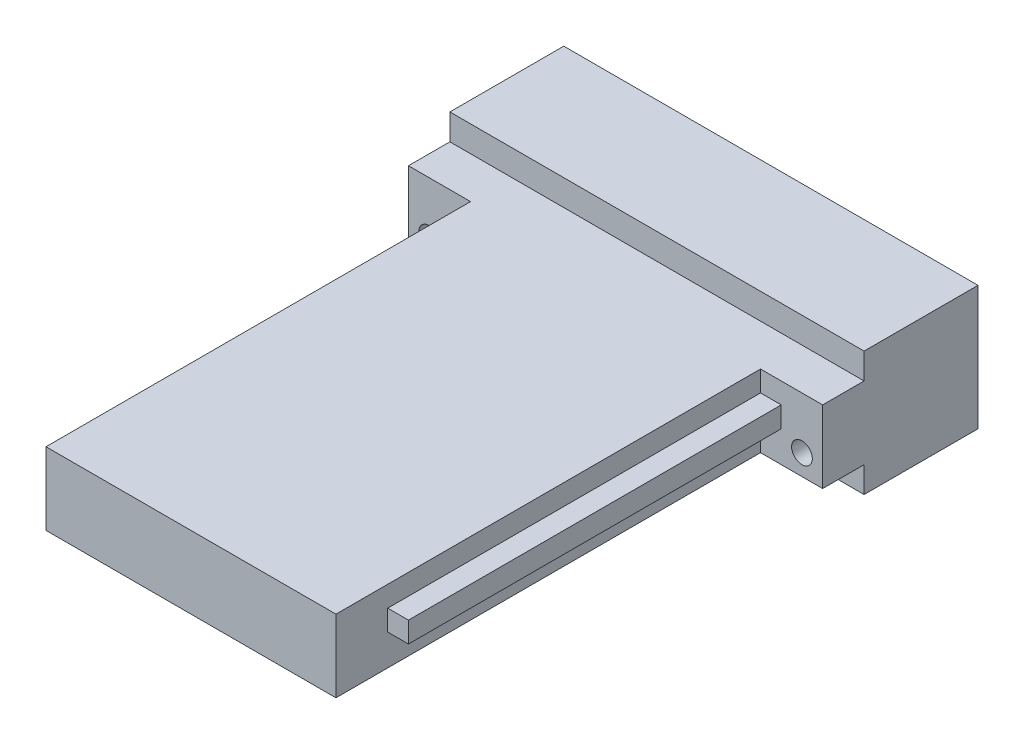
ISO-10303-21;
HEADER;
FILE_DESCRIPTION(('STEP AP214'),'2;1');
FILE_NAME('part.step','',(''),(''),'','','');
FILE_SCHEMA(('AUTOMOTIVE_DESIGN { 1 0 10303 214 1 1 1 1 }'));
ENDSEC;
DATA;
#1=APPLICATION_CONTEXT('core data for automotive mechanical design processes');
#2=APPLICATION_PROTOCOL_DEFINITION('international standard','automotive_design',2000,#1);
#3=PRODUCT_CONTEXT('',#1,'mechanical');
#4=PRODUCT('Part','Part','',(#3));
#5=PRODUCT_RELATED_PRODUCT_CATEGORY('part','',(#4));
#6=PRODUCT_DEFINITION_FORMATION('','',#4);
#7=PRODUCT_DEFINITION_CONTEXT('part definition',#1,'design');
#8=PRODUCT_DEFINITION('design','',#6,#7);
#9=PRODUCT_DEFINITION_SHAPE('','',#8);
#10=(LENGTH_UNIT() NAMED_UNIT(*) SI_UNIT(.MILLI.,.METRE.));
#11=(NAMED_UNIT(*) PLANE_ANGLE_UNIT() SI_UNIT($,.RADIAN.));
#12=(NAMED_UNIT(*) SI_UNIT($,.STERADIAN.) SOLID_ANGLE_UNIT());
#13=UNCERTAINTY_MEASURE_WITH_UNIT(LENGTH_MEASURE(1.E-05),#10,'distance_accuracy_value','');
#14=(GEOMETRIC_REPRESENTATION_CONTEXT(3) GLOBAL_UNCERTAINTY_ASSIGNED_CONTEXT((#13)) GLOBAL_UNIT_ASSIGNED_CONTEXT((#10,
#11,#12)) REPRESENTATION_CONTEXT('',''));
#15=CARTESIAN_POINT('',(0.,0.,0.));
#16=DIRECTION('',(0.,0.,1.));
#17=DIRECTION('',(1.,0.,0.));
#18=AXIS2_PLACEMENT_3D('',#15,#16,#17);
#19=CARTESIAN_POINT('',(0.,0.,-46.));
#20=DIRECTION('',(0.,0.,-1.));
#21=DIRECTION('',(-1.,0.,0.));
#22=AXIS2_PLACEMENT_3D('',#19,#20,#21);
#23=PLANE('',#22);
#24=DIRECTION('',(-1.,0.,0.));
#25=VECTOR('',#24,1.);
#26=CARTESIAN_POINT('',(26.,1.,-46.));
#27=LINE('',#26,#25);
#28=CARTESIAN_POINT('',(26.,1.,-46.));
#29=VERTEX_POINT('',#28);
#30=CARTESIAN_POINT('',(2.,1.,-46.));
#31=VERTEX_POINT('',#30);
#32=EDGE_CURVE('E256',#29,#31,#27,.T.);
#33=ORIENTED_EDGE('',*,*,#32,.F.);
#34=DIRECTION('',(0.,-1.,0.));
#35=VECTOR('',#34,1.);
#36=CARTESIAN_POINT('',(26.,8.5,-46.));
#37=LINE('',#36,#35);
#38=CARTESIAN_POINT('',(26.,-1.5,-46.));
#39=VERTEX_POINT('',#38);
#40=EDGE_CURVE('E268',#29,#39,#37,.T.);
#41=ORIENTED_EDGE('',*,*,#40,.T.);
#42=DIRECTION('',(-1.,0.,0.));
#43=VECTOR('',#42,1.);
#44=CARTESIAN_POINT('',(26.,-1.5,-46.));
#45=LINE('',#44,#43);
#46=CARTESIAN_POINT('',(2.,-1.5,-46.));
#47=VERTEX_POINT('',#46);
#48=EDGE_CURVE('E285',#39,#47,#45,.T.);
#49=ORIENTED_EDGE('',*,*,#48,.T.);
#50=DIRECTION('',(0.,1.,0.));
#51=VECTOR('',#50,1.);
#52=CARTESIAN_POINT('',(2.,8.5,-46.));
#53=LINE('',#52,#51);
#54=EDGE_CURVE('E270',#47,#31,#53,.T.);
#55=ORIENTED_EDGE('',*,*,#54,.T.);
#56=EDGE_LOOP('',(#33,#41,#49,#55));
#57=FACE_BOUND('',#56,.T.);
#58=ADVANCED_FACE('F46',(#57),#23,.T.);
#59=CARTESIAN_POINT('',(28.,7.,0.));
#60=DIRECTION('',(-1.,0.,0.));
#61=DIRECTION('',(0.,0.,1.));
#62=AXIS2_PLACEMENT_3D('',#59,#60,#61);
#63=PLANE('',#62);
#64=DIRECTION('',(0.,0.,1.));
#65=VECTOR('',#64,1.);
#66=CARTESIAN_POINT('',(28.,5.,-41.));
#67=LINE('',#66,#65);
#68=CARTESIAN_POINT('',(28.,5.,-41.));
#69=VERTEX_POINT('',#68);
#70=CARTESIAN_POINT('',(28.,5.,-5.));
#71=VERTEX_POINT('',#70);
#72=EDGE_CURVE('E362',#69,#71,#67,.T.);
#73=ORIENTED_EDGE('',*,*,#72,.F.);
#74=DIRECTION('',(0.,-1.,0.));
#75=VECTOR('',#74,1.);
#76=CARTESIAN_POINT('',(28.,0.,-41.));
#77=LINE('',#76,#75);
#78=CARTESIAN_POINT('',(28.,7.,-41.));
#79=VERTEX_POINT('',#78);
#80=EDGE_CURVE('E462',#79,#69,#77,.T.);
#81=ORIENTED_EDGE('',*,*,#80,.F.);
#82=DIRECTION('',(0.,0.,-1.));
#83=VECTOR('',#82,1.);
#84=CARTESIAN_POINT('',(28.,7.,0.));
#85=LINE('',#84,#83);
#86=CARTESIAN_POINT('',(28.,7.,0.));
#87=VERTEX_POINT('',#86);
#88=EDGE_CURVE('E484',#87,#79,#85,.T.);
#89=ORIENTED_EDGE('',*,*,#88,.F.);
#90=DIRECTION('',(0.,-1.,0.));
#91=VECTOR('',#90,1.);
#92=CARTESIAN_POINT('',(28.,7.,0.));
#93=LINE('',#92,#91);
#94=CARTESIAN_POINT('',(28.,0.,0.));
#95=VERTEX_POINT('',#94);
#96=EDGE_CURVE('E11',#87,#95,#93,.T.);
#97=ORIENTED_EDGE('',*,*,#96,.T.);
#98=DIRECTION('',(0.,0.,-1.));
#99=VECTOR('',#98,1.);
#100=CARTESIAN_POINT('',(28.,0.,0.));
#101=LINE('',#100,#99);
#102=CARTESIAN_POINT('',(28.,0.,-41.));
#103=VERTEX_POINT('',#102);
#104=EDGE_CURVE('E498',#95,#103,#101,.T.);
#105=ORIENTED_EDGE('',*,*,#104,.T.);
#106=CARTESIAN_POINT('',(28.,3.,-41.));
#107=VERTEX_POINT('',#106);
#108=EDGE_CURVE('E456',#107,#103,#77,.T.);
#109=ORIENTED_EDGE('',*,*,#108,.F.);
#110=DIRECTION('',(0.,0.,1.));
#111=VECTOR('',#110,1.);
#112=CARTESIAN_POINT('',(28.,3.,-41.));
#113=LINE('',#112,#111);
#114=CARTESIAN_POINT('',(28.,3.,-5.));
#115=VERTEX_POINT('',#114);
#116=EDGE_CURVE('E357',#107,#115,#113,.T.);
#117=ORIENTED_EDGE('',*,*,#116,.T.);
#118=DIRECTION('',(0.,-1.,0.));
#119=VECTOR('',#118,1.);
#120=CARTESIAN_POINT('',(28.,5.,-5.));
#121=LINE('',#120,#119);
#122=EDGE_CURVE('E374',#71,#115,#121,.T.);
#123=ORIENTED_EDGE('',*,*,#122,.F.);
#124=EDGE_LOOP('',(#73,#81,#89,#97,#105,#109,#117,#123));
#125=FACE_BOUND('',#124,.T.);
#126=ADVANCED_FACE('F577',(#125),#63,.F.);
#127=CARTESIAN_POINT('',(34.,0.,-41.));
#128=DIRECTION('',(0.,0.,-1.));
#129=DIRECTION('',(-1.,0.,0.));
#130=AXIS2_PLACEMENT_3D('',#127,#128,#129);
#131=PLANE('',#130);
#132=CARTESIAN_POINT('',(32.,2.,-41.));
#133=DIRECTION('',(0.,0.,1.));
#134=DIRECTION('',(1.,0.,0.));
#135=AXIS2_PLACEMENT_3D('',#132,#133,#134);
#136=CIRCLE('',#135,0.999999999999998);
#137=CARTESIAN_POINT('',(33.,2.,-41.));
#138=VERTEX_POINT('',#137);
#139=EDGE_CURVE('E434',#138,#138,#136,.T.);
#140=ORIENTED_EDGE('',*,*,#139,.F.);
#141=EDGE_LOOP('',(#140));
#142=FACE_BOUND('',#141,.T.);
#143=DIRECTION('',(-1.,0.,0.));
#144=VECTOR('',#143,1.);
#145=CARTESIAN_POINT('',(30.,5.,-41.));
#146=LINE('',#145,#144);
#147=CARTESIAN_POINT('',(30.,5.,-41.));
#148=VERTEX_POINT('',#147);
#149=EDGE_CURVE('E380',#148,#69,#146,.T.);
#150=ORIENTED_EDGE('',*,*,#149,.F.);
#151=DIRECTION('',(0.,-1.,0.));
#152=VECTOR('',#151,1.);
#153=CARTESIAN_POINT('',(30.,5.,-41.));
#154=LINE('',#153,#152);
#155=CARTESIAN_POINT('',(30.,3.,-41.));
#156=VERTEX_POINT('',#155);
#157=EDGE_CURVE('E358',#148,#156,#154,.T.);
#158=ORIENTED_EDGE('',*,*,#157,.T.);
#159=DIRECTION('',(-1.,0.,0.));
#160=VECTOR('',#159,1.);
#161=CARTESIAN_POINT('',(30.,3.,-41.));
#162=LINE('',#161,#160);
#163=EDGE_CURVE('E371',#156,#107,#162,.T.);
#164=ORIENTED_EDGE('',*,*,#163,.T.);
#165=ORIENTED_EDGE('',*,*,#108,.T.);
#166=DIRECTION('',(-1.,0.,0.));
#167=VECTOR('',#166,1.);
#168=CARTESIAN_POINT('',(34.,0.,-41.));
#169=LINE('',#168,#167);
#170=CARTESIAN_POINT('',(34.,0.,-41.));
#171=VERTEX_POINT('',#170);
#172=EDGE_CURVE('E469',#171,#103,#169,.T.);
#173=ORIENTED_EDGE('',*,*,#172,.F.);
#174=DIRECTION('',(0.,-1.,0.));
#175=VECTOR('',#174,1.);
#176=CARTESIAN_POINT('',(34.,0.,-41.));
#177=LINE('',#176,#175);
#178=CARTESIAN_POINT('',(34.,7.,-41.));
#179=VERTEX_POINT('',#178);
#180=EDGE_CURVE('E461',#179,#171,#177,.T.);
#181=ORIENTED_EDGE('',*,*,#180,.F.);
#182=DIRECTION('',(-1.,0.,0.));
#183=VECTOR('',#182,1.);
#184=CARTESIAN_POINT('',(34.,7.,-41.));
#185=LINE('',#184,#183);
#186=EDGE_CURVE('E476',#179,#79,#185,.T.);
#187=ORIENTED_EDGE('',*,*,#186,.T.);
#188=ORIENTED_EDGE('',*,*,#80,.T.);
#189=EDGE_LOOP('',(#150,#158,#164,#165,#173,#181,#187,#188));
#190=FACE_BOUND('',#189,.T.);
#191=ADVANCED_FACE('F581',(#142,#190),#131,.F.);
#192=CARTESIAN_POINT('',(0.,7.,0.));
#193=DIRECTION('',(-1.,0.,0.));
#194=DIRECTION('',(0.,0.,1.));
#195=AXIS2_PLACEMENT_3D('',#192,#193,#194);
#196=PLANE('',#195);
#197=DIRECTION('',(0.,-1.,0.));
#198=VECTOR('',#197,1.);
#199=CARTESIAN_POINT('',(0.,5.,-5.));
#200=LINE('',#199,#198);
#201=CARTESIAN_POINT('',(0.,5.,-5.));
#202=VERTEX_POINT('',#201);
#203=CARTESIAN_POINT('',(0.,3.,-5.));
#204=VERTEX_POINT('',#203);
#205=EDGE_CURVE('E408',#202,#204,#200,.T.);
#206=ORIENTED_EDGE('',*,*,#205,.T.);
#207=DIRECTION('',(0.,0.,1.));
#208=VECTOR('',#207,1.);
#209=CARTESIAN_POINT('',(0.,3.,-41.));
#210=LINE('',#209,#208);
#211=CARTESIAN_POINT('',(0.,3.,-41.));
#212=VERTEX_POINT('',#211);
#213=EDGE_CURVE('E384',#212,#204,#210,.T.);
#214=ORIENTED_EDGE('',*,*,#213,.F.);
#215=DIRECTION('',(0.,-1.,0.));
#216=VECTOR('',#215,1.);
#217=CARTESIAN_POINT('',(0.,7.,-41.));
#218=LINE('',#217,#216);
#219=CARTESIAN_POINT('',(0.,0.,-41.));
#220=VERTEX_POINT('',#219);
#221=EDGE_CURVE('E438',#212,#220,#218,.T.);
#222=ORIENTED_EDGE('',*,*,#221,.T.);
#223=DIRECTION('',(0.,0.,-1.));
#224=VECTOR('',#223,1.);
#225=CARTESIAN_POINT('',(0.,0.,0.));
#226=LINE('',#225,#224);
#227=CARTESIAN_POINT('',(0.,0.,0.));
#228=VERTEX_POINT('',#227);
#229=EDGE_CURVE('E485',#228,#220,#226,.T.);
#230=ORIENTED_EDGE('',*,*,#229,.F.);
#231=DIRECTION('',(0.,-1.,0.));
#232=VECTOR('',#231,1.);
#233=CARTESIAN_POINT('',(0.,7.,0.));
#234=LINE('',#233,#232);
#235=CARTESIAN_POINT('',(0.,7.,0.));
#236=VERTEX_POINT('',#235);
#237=EDGE_CURVE('E54',#236,#228,#234,.T.);
#238=ORIENTED_EDGE('',*,*,#237,.F.);
#239=DIRECTION('',(0.,0.,-1.));
#240=VECTOR('',#239,1.);
#241=CARTESIAN_POINT('',(0.,7.,0.));
#242=LINE('',#241,#240);
#243=CARTESIAN_POINT('',(0.,7.,-41.));
#244=VERTEX_POINT('',#243);
#245=EDGE_CURVE('E493',#236,#244,#242,.T.);
#246=ORIENTED_EDGE('',*,*,#245,.T.);
#247=CARTESIAN_POINT('',(0.,5.,-41.));
#248=VERTEX_POINT('',#247);
#249=EDGE_CURVE('E445',#244,#248,#218,.T.);
#250=ORIENTED_EDGE('',*,*,#249,.T.);
#251=DIRECTION('',(0.,0.,1.));
#252=VECTOR('',#251,1.);
#253=CARTESIAN_POINT('',(0.,5.,-41.));
#254=LINE('',#253,#252);
#255=EDGE_CURVE('E397',#248,#202,#254,.T.);
#256=ORIENTED_EDGE('',*,*,#255,.T.);
#257=EDGE_LOOP('',(#206,#214,#222,#230,#238,#246,#250,#256));
#258=FACE_BOUND('',#257,.T.);
#259=ADVANCED_FACE('F516',(#258),#196,.T.);
#260=CARTESIAN_POINT('',(-6.,7.,-41.));
#261=DIRECTION('',(0.,0.,1.));
#262=DIRECTION('',(1.,0.,0.));
#263=AXIS2_PLACEMENT_3D('',#260,#261,#262);
#264=PLANE('',#263);
#265=CARTESIAN_POINT('',(-4.,2.,-41.));
#266=DIRECTION('',(0.,0.,1.));
#267=DIRECTION('',(1.,0.,0.));
#268=AXIS2_PLACEMENT_3D('',#265,#266,#267);
#269=CIRCLE('',#268,1.);
#270=CARTESIAN_POINT('',(-3.,2.,-41.));
#271=VERTEX_POINT('',#270);
#272=EDGE_CURVE('E263',#271,#271,#269,.T.);
#273=ORIENTED_EDGE('',*,*,#272,.F.);
#274=EDGE_LOOP('',(#273));
#275=FACE_BOUND('',#274,.T.);
#276=ORIENTED_EDGE('',*,*,#221,.F.);
#277=DIRECTION('',(1.,0.,0.));
#278=VECTOR('',#277,1.);
#279=CARTESIAN_POINT('',(-2.,3.,-41.));
#280=LINE('',#279,#278);
#281=CARTESIAN_POINT('',(-2.,3.,-41.));
#282=VERTEX_POINT('',#281);
#283=EDGE_CURVE('E418',#282,#212,#280,.T.);
#284=ORIENTED_EDGE('',*,*,#283,.F.);
#285=DIRECTION('',(0.,-1.,0.));
#286=VECTOR('',#285,1.);
#287=CARTESIAN_POINT('',(-2.,5.,-41.));
#288=LINE('',#287,#286);
#289=CARTESIAN_POINT('',(-2.,5.,-41.));
#290=VERTEX_POINT('',#289);
#291=EDGE_CURVE('E393',#290,#282,#288,.T.);
#292=ORIENTED_EDGE('',*,*,#291,.F.);
#293=DIRECTION('',(1.,0.,0.));
#294=VECTOR('',#293,1.);
#295=CARTESIAN_POINT('',(-2.,5.,-41.));
#296=LINE('',#295,#294);
#297=EDGE_CURVE('E405',#290,#248,#296,.T.);
#298=ORIENTED_EDGE('',*,*,#297,.T.);
#299=ORIENTED_EDGE('',*,*,#249,.F.);
#300=DIRECTION('',(1.,0.,0.));
#301=VECTOR('',#300,1.);
#302=CARTESIAN_POINT('',(-6.,7.,-41.));
#303=LINE('',#302,#301);
#304=CARTESIAN_POINT('',(-6.,7.,-41.));
#305=VERTEX_POINT('',#304);
#306=EDGE_CURVE('E450',#305,#244,#303,.T.);
#307=ORIENTED_EDGE('',*,*,#306,.F.);
#308=DIRECTION('',(0.,-1.,0.));
#309=VECTOR('',#308,1.);
#310=CARTESIAN_POINT('',(-6.,7.,-41.));
#311=LINE('',#310,#309);
#312=CARTESIAN_POINT('',(-6.,0.,-41.));
#313=VERTEX_POINT('',#312);
#314=EDGE_CURVE('E444',#305,#313,#311,.T.);
#315=ORIENTED_EDGE('',*,*,#314,.T.);
#316=DIRECTION('',(1.,0.,0.));
#317=VECTOR('',#316,1.);
#318=CARTESIAN_POINT('',(-6.,0.,-41.));
#319=LINE('',#318,#317);
#320=EDGE_CURVE('E453',#313,#220,#319,.T.);
#321=ORIENTED_EDGE('',*,*,#320,.T.);
#322=EDGE_LOOP('',(#276,#284,#292,#298,#299,#307,#315,#321));
#323=FACE_BOUND('',#322,.T.);
#324=ADVANCED_FACE('F519',(#275,#323),#264,.T.);
#325=CARTESIAN_POINT('',(0.,7.,0.));
#326=DIRECTION('',(0.,0.,-1.));
#327=DIRECTION('',(-1.,0.,0.));
#328=AXIS2_PLACEMENT_3D('',#325,#326,#327);
#329=PLANE('',#328);
#330=DIRECTION('',(1.,0.,0.));
#331=VECTOR('',#330,1.);
#332=CARTESIAN_POINT('',(0.,0.,0.));
#333=LINE('',#332,#331);
#334=EDGE_CURVE('E480',#228,#95,#333,.T.);
#335=ORIENTED_EDGE('',*,*,#334,.T.);
#336=ORIENTED_EDGE('',*,*,#96,.F.);
#337=DIRECTION('',(1.,0.,0.));
#338=VECTOR('',#337,1.);
#339=CARTESIAN_POINT('',(0.,7.,0.));
#340=LINE('',#339,#338);
#341=EDGE_CURVE('E481',#236,#87,#340,.T.);
#342=ORIENTED_EDGE('',*,*,#341,.F.);
#343=ORIENTED_EDGE('',*,*,#237,.T.);
#344=EDGE_LOOP('',(#335,#336,#342,#343));
#345=FACE_BOUND('',#344,.T.);
#346=ADVANCED_FACE('F48',(#345),#329,.F.);
#347=CARTESIAN_POINT('',(0.,7.,0.));
#348=DIRECTION('',(0.,1.,0.));
#349=DIRECTION('',(0.,0.,1.));
#350=AXIS2_PLACEMENT_3D('',#347,#348,#349);
#351=PLANE('',#350);
#352=ORIENTED_EDGE('',*,*,#341,.T.);
#353=ORIENTED_EDGE('',*,*,#88,.T.);
#354=ORIENTED_EDGE('',*,*,#186,.F.);
#355=DIRECTION('',(0.,0.,1.));
#356=VECTOR('',#355,1.);
#357=CARTESIAN_POINT('',(34.,7.,-45.));
#358=LINE('',#357,#356);
#359=CARTESIAN_POINT('',(34.,7.,-45.));
#360=VERTEX_POINT('',#359);
#361=EDGE_CURVE('E458',#360,#179,#358,.T.);
#362=ORIENTED_EDGE('',*,*,#361,.F.);
#363=DIRECTION('',(1.,0.,0.));
#364=VECTOR('',#363,1.);
#365=CARTESIAN_POINT('',(0.,7.,-45.));
#366=LINE('',#365,#364);
#367=CARTESIAN_POINT('',(-6.,7.,-45.));
#368=VERTEX_POINT('',#367);
#369=EDGE_CURVE('E489',#368,#360,#366,.T.);
#370=ORIENTED_EDGE('',*,*,#369,.F.);
#371=DIRECTION('',(0.,0.,1.));
#372=VECTOR('',#371,1.);
#373=CARTESIAN_POINT('',(-6.,7.,-45.));
#374=LINE('',#373,#372);
#375=EDGE_CURVE('E441',#368,#305,#374,.T.);
#376=ORIENTED_EDGE('',*,*,#375,.T.);
#377=ORIENTED_EDGE('',*,*,#306,.T.);
#378=ORIENTED_EDGE('',*,*,#245,.F.);
#379=EDGE_LOOP('',(#352,#353,#354,#362,#370,#376,#377,#378));
#380=FACE_BOUND('',#379,.T.);
#381=ADVANCED_FACE('F593',(#380),#351,.T.);
#382=CARTESIAN_POINT('',(0.,0.,0.));
#383=DIRECTION('',(0.,1.,0.));
#384=DIRECTION('',(0.,0.,1.));
#385=AXIS2_PLACEMENT_3D('',#382,#383,#384);
#386=PLANE('',#385);
#387=ORIENTED_EDGE('',*,*,#334,.F.);
#388=ORIENTED_EDGE('',*,*,#229,.T.);
#389=ORIENTED_EDGE('',*,*,#320,.F.);
#390=DIRECTION('',(0.,0.,1.));
#391=VECTOR('',#390,1.);
#392=CARTESIAN_POINT('',(-6.,0.,-45.));
#393=LINE('',#392,#391);
#394=CARTESIAN_POINT('',(-6.,0.,-45.));
#395=VERTEX_POINT('',#394);
#396=EDGE_CURVE('E448',#395,#313,#393,.T.);
#397=ORIENTED_EDGE('',*,*,#396,.F.);
#398=DIRECTION('',(1.,0.,0.));
#399=VECTOR('',#398,1.);
#400=CARTESIAN_POINT('',(0.,0.,-45.));
#401=LINE('',#400,#399);
#402=CARTESIAN_POINT('',(34.,0.,-45.));
#403=VERTEX_POINT('',#402);
#404=EDGE_CURVE('E502',#395,#403,#401,.T.);
#405=ORIENTED_EDGE('',*,*,#404,.T.);
#406=DIRECTION('',(0.,0.,-1.));
#407=VECTOR('',#406,1.);
#408=CARTESIAN_POINT('',(34.,0.,-45.));
#409=LINE('',#408,#407);
#410=EDGE_CURVE('E465',#171,#403,#409,.T.);
#411=ORIENTED_EDGE('',*,*,#410,.F.);
#412=ORIENTED_EDGE('',*,*,#172,.T.);
#413=ORIENTED_EDGE('',*,*,#104,.F.);
#414=EDGE_LOOP('',(#387,#388,#389,#397,#405,#411,#412,#413));
#415=FACE_BOUND('',#414,.T.);
#416=ADVANCED_FACE('F514',(#415),#386,.F.);
#417=CARTESIAN_POINT('',(34.,0.,0.));
#418=DIRECTION('',(1.,0.,0.));
#419=DIRECTION('',(0.,0.,-1.));
#420=AXIS2_PLACEMENT_3D('',#417,#418,#419);
#421=PLANE('',#420);
#422=ORIENTED_EDGE('',*,*,#410,.T.);
#423=DIRECTION('',(0.,-1.,0.));
#424=VECTOR('',#423,1.);
#425=CARTESIAN_POINT('',(34.,9.5,-45.));
#426=LINE('',#425,#424);
#427=CARTESIAN_POINT('',(34.,-2.5,-45.));
#428=VERTEX_POINT('',#427);
#429=EDGE_CURVE('E310',#403,#428,#426,.T.);
#430=ORIENTED_EDGE('',*,*,#429,.T.);
#431=DIRECTION('',(0.,0.,1.));
#432=VECTOR('',#431,1.);
#433=CARTESIAN_POINT('',(34.,-2.5,-56.));
#434=LINE('',#433,#432);
#435=CARTESIAN_POINT('',(34.,-2.5,-56.));
#436=VERTEX_POINT('',#435);
#437=EDGE_CURVE('E353',#436,#428,#434,.T.);
#438=ORIENTED_EDGE('',*,*,#437,.F.);
#439=DIRECTION('',(0.,-1.,0.));
#440=VECTOR('',#439,1.);
#441=CARTESIAN_POINT('',(34.,9.5,-56.));
#442=LINE('',#441,#440);
#443=CARTESIAN_POINT('',(34.,9.5,-56.));
#444=VERTEX_POINT('',#443);
#445=EDGE_CURVE('E317',#444,#436,#442,.T.);
#446=ORIENTED_EDGE('',*,*,#445,.F.);
#447=DIRECTION('',(0.,0.,1.));
#448=VECTOR('',#447,1.);
#449=CARTESIAN_POINT('',(34.,9.5,-56.));
#450=LINE('',#449,#448);
#451=CARTESIAN_POINT('',(34.,9.5,-45.));
#452=VERTEX_POINT('',#451);
#453=EDGE_CURVE('E330',#444,#452,#450,.T.);
#454=ORIENTED_EDGE('',*,*,#453,.T.);
#455=EDGE_CURVE('E331',#452,#360,#426,.T.);
#456=ORIENTED_EDGE('',*,*,#455,.T.);
#457=ORIENTED_EDGE('',*,*,#361,.T.);
#458=ORIENTED_EDGE('',*,*,#180,.T.);
#459=EDGE_LOOP('',(#422,#430,#438,#446,#454,#456,#457,#458));
#460=FACE_BOUND('',#459,.T.);
#461=ADVANCED_FACE('F539',(#460),#421,.T.);
#462=CARTESIAN_POINT('',(-6.,0.,0.));
#463=DIRECTION('',(1.,0.,0.));
#464=DIRECTION('',(0.,0.,-1.));
#465=AXIS2_PLACEMENT_3D('',#462,#463,#464);
#466=PLANE('',#465);
#467=ORIENTED_EDGE('',*,*,#375,.F.);
#468=DIRECTION('',(0.,1.,0.));
#469=VECTOR('',#468,1.);
#470=CARTESIAN_POINT('',(-6.,9.5,-45.));
#471=LINE('',#470,#469);
#472=CARTESIAN_POINT('',(-6.,9.5,-45.));
#473=VERTEX_POINT('',#472);
#474=EDGE_CURVE('E338',#368,#473,#471,.T.);
#475=ORIENTED_EDGE('',*,*,#474,.T.);
#476=DIRECTION('',(0.,0.,1.));
#477=VECTOR('',#476,1.);
#478=CARTESIAN_POINT('',(-6.,9.5,-56.));
#479=LINE('',#478,#477);
#480=CARTESIAN_POINT('',(-6.,9.5,-56.));
#481=VERTEX_POINT('',#480);
#482=EDGE_CURVE('E347',#481,#473,#479,.T.);
#483=ORIENTED_EDGE('',*,*,#482,.F.);
#484=DIRECTION('',(0.,1.,0.));
#485=VECTOR('',#484,1.);
#486=CARTESIAN_POINT('',(-6.,9.5,-56.));
#487=LINE('',#486,#485);
#488=CARTESIAN_POINT('',(-6.,-2.5,-56.));
#489=VERTEX_POINT('',#488);
#490=EDGE_CURVE('E325',#489,#481,#487,.T.);
#491=ORIENTED_EDGE('',*,*,#490,.F.);
#492=DIRECTION('',(0.,0.,1.));
#493=VECTOR('',#492,1.);
#494=CARTESIAN_POINT('',(-6.,-2.5,-56.));
#495=LINE('',#494,#493);
#496=CARTESIAN_POINT('',(-6.,-2.5,-45.));
#497=VERTEX_POINT('',#496);
#498=EDGE_CURVE('E350',#489,#497,#495,.T.);
#499=ORIENTED_EDGE('',*,*,#498,.T.);
#500=EDGE_CURVE('E339',#497,#395,#471,.T.);
#501=ORIENTED_EDGE('',*,*,#500,.T.);
#502=ORIENTED_EDGE('',*,*,#396,.T.);
#503=ORIENTED_EDGE('',*,*,#314,.F.);
#504=EDGE_LOOP('',(#467,#475,#483,#491,#499,#501,#502,#503));
#505=FACE_BOUND('',#504,.T.);
#506=ADVANCED_FACE('F530',(#505),#466,.F.);
#507=CARTESIAN_POINT('',(-4.,2.,-47.));
#508=DIRECTION('',(0.,0.,1.));
#509=DIRECTION('',(1.,0.,0.));
#510=AXIS2_PLACEMENT_3D('',#507,#508,#509);
#511=CYLINDRICAL_SURFACE('',#510,1.);
#512=ORIENTED_EDGE('',*,*,#272,.T.);
#513=EDGE_LOOP('',(#512));
#514=FACE_BOUND('',#513,.T.);
#515=CARTESIAN_POINT('',(-4.,2.,-56.));
#516=DIRECTION('',(0.,0.,1.));
#517=DIRECTION('',(1.,0.,0.));
#518=AXIS2_PLACEMENT_3D('',#515,#516,#517);
#519=CIRCLE('',#518,1.);
#520=CARTESIAN_POINT('',(-3.,2.,-56.));
#521=VERTEX_POINT('',#520);
#522=EDGE_CURVE('E668',#521,#521,#519,.T.);
#523=ORIENTED_EDGE('',*,*,#522,.F.);
#524=EDGE_LOOP('',(#523));
#525=FACE_BOUND('',#524,.T.);
#526=ADVANCED_FACE('F604',(#514,#525),#511,.F.);
#527=CARTESIAN_POINT('',(32.,2.,-47.));
#528=DIRECTION('',(0.,0.,1.));
#529=DIRECTION('',(1.,0.,0.));
#530=AXIS2_PLACEMENT_3D('',#527,#528,#529);
#531=CYLINDRICAL_SURFACE('',#530,0.999999999999998);
#532=ORIENTED_EDGE('',*,*,#139,.T.);
#533=EDGE_LOOP('',(#532));
#534=FACE_BOUND('',#533,.T.);
#535=CARTESIAN_POINT('',(32.,2.,-56.));
#536=DIRECTION('',(0.,0.,1.));
#537=DIRECTION('',(1.,0.,0.));
#538=AXIS2_PLACEMENT_3D('',#535,#536,#537);
#539=CIRCLE('',#538,0.999999999999998);
#540=CARTESIAN_POINT('',(33.,2.,-56.));
#541=VERTEX_POINT('',#540);
#542=EDGE_CURVE('E273',#541,#541,#539,.T.);
#543=ORIENTED_EDGE('',*,*,#542,.F.);
#544=EDGE_LOOP('',(#543));
#545=FACE_BOUND('',#544,.T.);
#546=ADVANCED_FACE('F607',(#534,#545),#531,.F.);
#547=CARTESIAN_POINT('',(-2.,3.,-41.));
#548=DIRECTION('',(0.,1.,0.));
#549=DIRECTION('',(0.,0.,1.));
#550=AXIS2_PLACEMENT_3D('',#547,#548,#549);
#551=PLANE('',#550);
#552=ORIENTED_EDGE('',*,*,#213,.T.);
#553=DIRECTION('',(1.,0.,0.));
#554=VECTOR('',#553,1.);
#555=CARTESIAN_POINT('',(-2.,3.,-5.));
#556=LINE('',#555,#554);
#557=CARTESIAN_POINT('',(-2.,3.,-5.));
#558=VERTEX_POINT('',#557);
#559=EDGE_CURVE('E415',#558,#204,#556,.T.);
#560=ORIENTED_EDGE('',*,*,#559,.F.);
#561=DIRECTION('',(0.,0.,1.));
#562=VECTOR('',#561,1.);
#563=CARTESIAN_POINT('',(-2.,3.,-41.));
#564=LINE('',#563,#562);
#565=EDGE_CURVE('E396',#282,#558,#564,.T.);
#566=ORIENTED_EDGE('',*,*,#565,.F.);
#567=ORIENTED_EDGE('',*,*,#283,.T.);
#568=EDGE_LOOP('',(#552,#560,#566,#567));
#569=FACE_BOUND('',#568,.T.);
#570=ADVANCED_FACE('F611',(#569),#551,.F.);
#571=CARTESIAN_POINT('',(-2.,5.,-5.));
#572=DIRECTION('',(0.,0.,1.));
#573=DIRECTION('',(1.,0.,0.));
#574=AXIS2_PLACEMENT_3D('',#571,#572,#573);
#575=PLANE('',#574);
#576=ORIENTED_EDGE('',*,*,#205,.F.);
#577=DIRECTION('',(1.,0.,0.));
#578=VECTOR('',#577,1.);
#579=CARTESIAN_POINT('',(-2.,5.,-5.));
#580=LINE('',#579,#578);
#581=CARTESIAN_POINT('',(-2.,5.,-5.));
#582=VERTEX_POINT('',#581);
#583=EDGE_CURVE('E412',#582,#202,#580,.T.);
#584=ORIENTED_EDGE('',*,*,#583,.F.);
#585=DIRECTION('',(0.,-1.,0.));
#586=VECTOR('',#585,1.);
#587=CARTESIAN_POINT('',(-2.,5.,-5.));
#588=LINE('',#587,#586);
#589=EDGE_CURVE('E399',#582,#558,#588,.T.);
#590=ORIENTED_EDGE('',*,*,#589,.T.);
#591=ORIENTED_EDGE('',*,*,#559,.T.);
#592=EDGE_LOOP('',(#576,#584,#590,#591));
#593=FACE_BOUND('',#592,.T.);
#594=ADVANCED_FACE('F625',(#593),#575,.T.);
#595=CARTESIAN_POINT('',(-2.,5.,-41.));
#596=DIRECTION('',(0.,1.,0.));
#597=DIRECTION('',(0.,0.,1.));
#598=AXIS2_PLACEMENT_3D('',#595,#596,#597);
#599=PLANE('',#598);
#600=ORIENTED_EDGE('',*,*,#255,.F.);
#601=ORIENTED_EDGE('',*,*,#297,.F.);
#602=DIRECTION('',(0.,0.,1.));
#603=VECTOR('',#602,1.);
#604=CARTESIAN_POINT('',(-2.,5.,-41.));
#605=LINE('',#604,#603);
#606=EDGE_CURVE('E402',#290,#582,#605,.T.);
#607=ORIENTED_EDGE('',*,*,#606,.T.);
#608=ORIENTED_EDGE('',*,*,#583,.T.);
#609=EDGE_LOOP('',(#600,#601,#607,#608));
#610=FACE_BOUND('',#609,.T.);
#611=ADVANCED_FACE('F629',(#610),#599,.T.);
#612=CARTESIAN_POINT('',(-2.,0.,0.));
#613=DIRECTION('',(-1.,0.,0.));
#614=DIRECTION('',(0.,0.,1.));
#615=AXIS2_PLACEMENT_3D('',#612,#613,#614);
#616=PLANE('',#615);
#617=ORIENTED_EDGE('',*,*,#291,.T.);
#618=ORIENTED_EDGE('',*,*,#565,.T.);
#619=ORIENTED_EDGE('',*,*,#589,.F.);
#620=ORIENTED_EDGE('',*,*,#606,.F.);
#621=EDGE_LOOP('',(#617,#618,#619,#620));
#622=FACE_BOUND('',#621,.T.);
#623=ADVANCED_FACE('F633',(#622),#616,.T.);
#624=CARTESIAN_POINT('',(30.,5.,-41.));
#625=DIRECTION('',(0.,-1.,0.));
#626=DIRECTION('',(0.,0.,-1.));
#627=AXIS2_PLACEMENT_3D('',#624,#625,#626);
#628=PLANE('',#627);
#629=ORIENTED_EDGE('',*,*,#72,.T.);
#630=DIRECTION('',(-1.,0.,0.));
#631=VECTOR('',#630,1.);
#632=CARTESIAN_POINT('',(30.,5.,-5.));
#633=LINE('',#632,#631);
#634=CARTESIAN_POINT('',(30.,5.,-5.));
#635=VERTEX_POINT('',#634);
#636=EDGE_CURVE('E385',#635,#71,#633,.T.);
#637=ORIENTED_EDGE('',*,*,#636,.F.);
#638=DIRECTION('',(0.,0.,1.));
#639=VECTOR('',#638,1.);
#640=CARTESIAN_POINT('',(30.,5.,-41.));
#641=LINE('',#640,#639);
#642=EDGE_CURVE('E368',#148,#635,#641,.T.);
#643=ORIENTED_EDGE('',*,*,#642,.F.);
#644=ORIENTED_EDGE('',*,*,#149,.T.);
#645=EDGE_LOOP('',(#629,#637,#643,#644));
#646=FACE_BOUND('',#645,.T.);
#647=ADVANCED_FACE('F637',(#646),#628,.F.);
#648=CARTESIAN_POINT('',(30.,5.,-5.));
#649=DIRECTION('',(0.,0.,-1.));
#650=DIRECTION('',(-1.,0.,0.));
#651=AXIS2_PLACEMENT_3D('',#648,#649,#650);
#652=PLANE('',#651);
#653=ORIENTED_EDGE('',*,*,#122,.T.);
#654=DIRECTION('',(-1.,0.,0.));
#655=VECTOR('',#654,1.);
#656=CARTESIAN_POINT('',(30.,3.,-5.));
#657=LINE('',#656,#655);
#658=CARTESIAN_POINT('',(30.,3.,-5.));
#659=VERTEX_POINT('',#658);
#660=EDGE_CURVE('E388',#659,#115,#657,.T.);
#661=ORIENTED_EDGE('',*,*,#660,.F.);
#662=DIRECTION('',(0.,-1.,0.));
#663=VECTOR('',#662,1.);
#664=CARTESIAN_POINT('',(30.,5.,-5.));
#665=LINE('',#664,#663);
#666=EDGE_CURVE('E366',#635,#659,#665,.T.);
#667=ORIENTED_EDGE('',*,*,#666,.F.);
#668=ORIENTED_EDGE('',*,*,#636,.T.);
#669=EDGE_LOOP('',(#653,#661,#667,#668));
#670=FACE_BOUND('',#669,.T.);
#671=ADVANCED_FACE('F643',(#670),#652,.F.);
#672=CARTESIAN_POINT('',(30.,3.,-41.));
#673=DIRECTION('',(0.,-1.,0.));
#674=DIRECTION('',(0.,0.,-1.));
#675=AXIS2_PLACEMENT_3D('',#672,#673,#674);
#676=PLANE('',#675);
#677=ORIENTED_EDGE('',*,*,#116,.F.);
#678=ORIENTED_EDGE('',*,*,#163,.F.);
#679=DIRECTION('',(0.,0.,1.));
#680=VECTOR('',#679,1.);
#681=CARTESIAN_POINT('',(30.,3.,-41.));
#682=LINE('',#681,#680);
#683=EDGE_CURVE('E361',#156,#659,#682,.T.);
#684=ORIENTED_EDGE('',*,*,#683,.T.);
#685=ORIENTED_EDGE('',*,*,#660,.T.);
#686=EDGE_LOOP('',(#677,#678,#684,#685));
#687=FACE_BOUND('',#686,.T.);
#688=ADVANCED_FACE('F639',(#687),#676,.T.);
#689=CARTESIAN_POINT('',(30.,0.,0.));
#690=DIRECTION('',(-1.,0.,0.));
#691=DIRECTION('',(0.,0.,1.));
#692=AXIS2_PLACEMENT_3D('',#689,#690,#691);
#693=PLANE('',#692);
#694=ORIENTED_EDGE('',*,*,#157,.F.);
#695=ORIENTED_EDGE('',*,*,#642,.T.);
#696=ORIENTED_EDGE('',*,*,#666,.T.);
#697=ORIENTED_EDGE('',*,*,#683,.F.);
#698=EDGE_LOOP('',(#694,#695,#696,#697));
#699=FACE_BOUND('',#698,.T.);
#700=ADVANCED_FACE('F642',(#699),#693,.F.);
#701=CARTESIAN_POINT('',(0.,0.,-45.));
#702=DIRECTION('',(0.,0.,-1.));
#703=DIRECTION('',(-1.,0.,0.));
#704=AXIS2_PLACEMENT_3D('',#701,#702,#703);
#705=PLANE('',#704);
#706=ORIENTED_EDGE('',*,*,#404,.F.);
#707=ORIENTED_EDGE('',*,*,#500,.F.);
#708=DIRECTION('',(-1.,0.,0.));
#709=VECTOR('',#708,1.);
#710=CARTESIAN_POINT('',(34.,-2.5,-45.));
#711=LINE('',#710,#709);
#712=EDGE_CURVE('E335',#428,#497,#711,.T.);
#713=ORIENTED_EDGE('',*,*,#712,.F.);
#714=ORIENTED_EDGE('',*,*,#429,.F.);
#715=EDGE_LOOP('',(#706,#707,#713,#714));
#716=FACE_BOUND('',#715,.T.);
#717=ADVANCED_FACE('F527',(#716),#705,.F.);
#718=CARTESIAN_POINT('',(0.,0.,-56.));
#719=DIRECTION('',(0.,0.,-1.));
#720=DIRECTION('',(-1.,0.,0.));
#721=AXIS2_PLACEMENT_3D('',#718,#719,#720);
#722=PLANE('',#721);
#723=ORIENTED_EDGE('',*,*,#522,.T.);
#724=EDGE_LOOP('',(#723));
#725=FACE_BOUND('',#724,.T.);
#726=ORIENTED_EDGE('',*,*,#542,.T.);
#727=EDGE_LOOP('',(#726));
#728=FACE_BOUND('',#727,.T.);
#729=DIRECTION('',(0.,-1.,0.));
#730=VECTOR('',#729,1.);
#731=CARTESIAN_POINT('',(26.,8.5,-56.));
#732=LINE('',#731,#730);
#733=CARTESIAN_POINT('',(26.,8.5,-56.));
#734=VERTEX_POINT('',#733);
#735=CARTESIAN_POINT('',(26.,-1.5,-56.));
#736=VERTEX_POINT('',#735);
#737=EDGE_CURVE('E71',#734,#736,#732,.T.);
#738=ORIENTED_EDGE('',*,*,#737,.F.);
#739=DIRECTION('',(1.,0.,0.));
#740=VECTOR('',#739,1.);
#741=CARTESIAN_POINT('',(26.,8.5,-56.));
#742=LINE('',#741,#740);
#743=CARTESIAN_POINT('',(2.,8.5,-56.));
#744=VERTEX_POINT('',#743);
#745=EDGE_CURVE('E280',#744,#734,#742,.T.);
#746=ORIENTED_EDGE('',*,*,#745,.F.);
#747=DIRECTION('',(0.,1.,0.));
#748=VECTOR('',#747,1.);
#749=CARTESIAN_POINT('',(2.,8.5,-56.));
#750=LINE('',#749,#748);
#751=CARTESIAN_POINT('',(2.,-1.5,-56.));
#752=VERTEX_POINT('',#751);
#753=EDGE_CURVE('E288',#752,#744,#750,.T.);
#754=ORIENTED_EDGE('',*,*,#753,.F.);
#755=DIRECTION('',(-1.,0.,0.));
#756=VECTOR('',#755,1.);
#757=CARTESIAN_POINT('',(26.,-1.5,-56.));
#758=LINE('',#757,#756);
#759=EDGE_CURVE('E301',#736,#752,#758,.T.);
#760=ORIENTED_EDGE('',*,*,#759,.F.);
#761=EDGE_LOOP('',(#738,#746,#754,#760));
#762=FACE_BOUND('',#761,.T.);
#763=ORIENTED_EDGE('',*,*,#445,.T.);
#764=DIRECTION('',(-1.,0.,0.));
#765=VECTOR('',#764,1.);
#766=CARTESIAN_POINT('',(34.,-2.5,-56.));
#767=LINE('',#766,#765);
#768=EDGE_CURVE('E321',#436,#489,#767,.T.);
#769=ORIENTED_EDGE('',*,*,#768,.T.);
#770=ORIENTED_EDGE('',*,*,#490,.T.);
#771=DIRECTION('',(1.,0.,0.));
#772=VECTOR('',#771,1.);
#773=CARTESIAN_POINT('',(34.,9.5,-56.));
#774=LINE('',#773,#772);
#775=EDGE_CURVE('E327',#481,#444,#774,.T.);
#776=ORIENTED_EDGE('',*,*,#775,.T.);
#777=EDGE_LOOP('',(#763,#769,#770,#776));
#778=FACE_BOUND('',#777,.T.);
#779=ADVANCED_FACE('F562',(#725,#728,#762,#778),#722,.T.);
#780=CARTESIAN_POINT('',(34.,9.5,-56.));
#781=DIRECTION('',(0.,-1.,0.));
#782=DIRECTION('',(0.,0.,-1.));
#783=AXIS2_PLACEMENT_3D('',#780,#781,#782);
#784=PLANE('',#783);
#785=DIRECTION('',(1.,0.,0.));
#786=VECTOR('',#785,1.);
#787=CARTESIAN_POINT('',(34.,9.5,-45.));
#788=LINE('',#787,#786);
#789=EDGE_CURVE('E322',#473,#452,#788,.T.);
#790=ORIENTED_EDGE('',*,*,#789,.T.);
#791=ORIENTED_EDGE('',*,*,#453,.F.);
#792=ORIENTED_EDGE('',*,*,#775,.F.);
#793=ORIENTED_EDGE('',*,*,#482,.T.);
#794=EDGE_LOOP('',(#790,#791,#792,#793));
#795=FACE_BOUND('',#794,.T.);
#796=ADVANCED_FACE('F656',(#795),#784,.F.);
#797=CARTESIAN_POINT('',(34.,-2.5,-56.));
#798=DIRECTION('',(0.,1.,0.));
#799=DIRECTION('',(0.,0.,1.));
#800=AXIS2_PLACEMENT_3D('',#797,#798,#799);
#801=PLANE('',#800);
#802=ORIENTED_EDGE('',*,*,#712,.T.);
#803=ORIENTED_EDGE('',*,*,#498,.F.);
#804=ORIENTED_EDGE('',*,*,#768,.F.);
#805=ORIENTED_EDGE('',*,*,#437,.T.);
#806=EDGE_LOOP('',(#802,#803,#804,#805));
#807=FACE_BOUND('',#806,.T.);
#808=ADVANCED_FACE('F535',(#807),#801,.F.);
#809=ORIENTED_EDGE('',*,*,#474,.F.);
#810=ORIENTED_EDGE('',*,*,#369,.T.);
#811=ORIENTED_EDGE('',*,*,#455,.F.);
#812=ORIENTED_EDGE('',*,*,#789,.F.);
#813=EDGE_LOOP('',(#809,#810,#811,#812));
#814=FACE_BOUND('',#813,.T.);
#815=ADVANCED_FACE('F573',(#814),#705,.F.);
#816=CARTESIAN_POINT('',(26.,8.5,-46.));
#817=DIRECTION('',(0.,1.,0.));
#818=DIRECTION('',(0.,0.,1.));
#819=AXIS2_PLACEMENT_3D('',#816,#817,#818);
#820=PLANE('',#819);
#821=ORIENTED_EDGE('',*,*,#745,.T.);
#822=DIRECTION('',(0.,0.,-1.));
#823=VECTOR('',#822,1.);
#824=CARTESIAN_POINT('',(26.,8.5,-46.));
#825=LINE('',#824,#823);
#826=CARTESIAN_POINT('',(26.,8.5,-46.));
#827=VERTEX_POINT('',#826);
#828=EDGE_CURVE('E307',#827,#734,#825,.T.);
#829=ORIENTED_EDGE('',*,*,#828,.F.);
#830=DIRECTION('',(1.,0.,0.));
#831=VECTOR('',#830,1.);
#832=CARTESIAN_POINT('',(26.,8.5,-46.));
#833=LINE('',#832,#831);
#834=CARTESIAN_POINT('',(2.,8.5,-46.));
#835=VERTEX_POINT('',#834);
#836=EDGE_CURVE('E295',#835,#827,#833,.T.);
#837=ORIENTED_EDGE('',*,*,#836,.F.);
#838=DIRECTION('',(0.,0.,-1.));
#839=VECTOR('',#838,1.);
#840=CARTESIAN_POINT('',(2.,8.5,-46.));
#841=LINE('',#840,#839);
#842=EDGE_CURVE('E311',#835,#744,#841,.T.);
#843=ORIENTED_EDGE('',*,*,#842,.T.);
#844=EDGE_LOOP('',(#821,#829,#837,#843));
#845=FACE_BOUND('',#844,.T.);
#846=ADVANCED_FACE('F559',(#845),#820,.F.);
#847=CARTESIAN_POINT('',(26.,-1.5,-46.));
#848=DIRECTION('',(0.,-1.,0.));
#849=DIRECTION('',(0.,0.,-1.));
#850=AXIS2_PLACEMENT_3D('',#847,#848,#849);
#851=PLANE('',#850);
#852=ORIENTED_EDGE('',*,*,#759,.T.);
#853=DIRECTION('',(0.,0.,-1.));
#854=VECTOR('',#853,1.);
#855=CARTESIAN_POINT('',(2.,-1.5,-46.));
#856=LINE('',#855,#854);
#857=EDGE_CURVE('E313',#47,#752,#856,.T.);
#858=ORIENTED_EDGE('',*,*,#857,.F.);
#859=ORIENTED_EDGE('',*,*,#48,.F.);
#860=DIRECTION('',(0.,0.,-1.));
#861=VECTOR('',#860,1.);
#862=CARTESIAN_POINT('',(26.,-1.5,-46.));
#863=LINE('',#862,#861);
#864=EDGE_CURVE('E276',#39,#736,#863,.T.);
#865=ORIENTED_EDGE('',*,*,#864,.T.);
#866=EDGE_LOOP('',(#852,#858,#859,#865));
#867=FACE_BOUND('',#866,.T.);
#868=ADVANCED_FACE('F565',(#867),#851,.F.);
#869=DIRECTION('',(1.,0.,0.));
#870=VECTOR('',#869,1.);
#871=CARTESIAN_POINT('',(26.,6.,-46.));
#872=LINE('',#871,#870);
#873=CARTESIAN_POINT('',(2.,6.,-46.));
#874=VERTEX_POINT('',#873);
#875=CARTESIAN_POINT('',(26.,6.,-46.));
#876=VERTEX_POINT('',#875);
#877=EDGE_CURVE('E272',#874,#876,#872,.T.);
#878=ORIENTED_EDGE('',*,*,#877,.F.);
#879=EDGE_CURVE('E293',#874,#835,#53,.T.);
#880=ORIENTED_EDGE('',*,*,#879,.T.);
#881=ORIENTED_EDGE('',*,*,#836,.T.);
#882=EDGE_CURVE('E279',#827,#876,#37,.T.);
#883=ORIENTED_EDGE('',*,*,#882,.T.);
#884=EDGE_LOOP('',(#878,#880,#881,#883));
#885=FACE_BOUND('',#884,.T.);
#886=ADVANCED_FACE('F548',(#885),#23,.T.);
#887=CARTESIAN_POINT('',(0.,0.,-2.));
#888=DIRECTION('',(0.,0.,-1.));
#889=DIRECTION('',(-1.,0.,0.));
#890=AXIS2_PLACEMENT_3D('',#887,#888,#889);
#891=PLANE('',#890);
#892=DIRECTION('',(-1.,0.,0.));
#893=VECTOR('',#892,1.);
#894=CARTESIAN_POINT('',(26.,1.,-2.));
#895=LINE('',#894,#893);
#896=CARTESIAN_POINT('',(26.,1.,-2.));
#897=VERTEX_POINT('',#896);
#898=CARTESIAN_POINT('',(2.,1.,-2.));
#899=VERTEX_POINT('',#898);
#900=EDGE_CURVE('E259',#897,#899,#895,.T.);
#901=ORIENTED_EDGE('',*,*,#900,.T.);
#902=DIRECTION('',(0.,1.,0.));
#903=VECTOR('',#902,1.);
#904=CARTESIAN_POINT('',(2.,1.,-2.));
#905=LINE('',#904,#903);
#906=CARTESIAN_POINT('',(2.,6.,-2.));
#907=VERTEX_POINT('',#906);
#908=EDGE_CURVE('E422',#899,#907,#905,.T.);
#909=ORIENTED_EDGE('',*,*,#908,.T.);
#910=DIRECTION('',(-1.,0.,0.));
#911=VECTOR('',#910,1.);
#912=CARTESIAN_POINT('',(26.,6.,-2.));
#913=LINE('',#912,#911);
#914=CARTESIAN_POINT('',(26.,6.,-2.));
#915=VERTEX_POINT('',#914);
#916=EDGE_CURVE('E425',#915,#907,#913,.T.);
#917=ORIENTED_EDGE('',*,*,#916,.F.);
#918=DIRECTION('',(0.,1.,0.));
#919=VECTOR('',#918,1.);
#920=CARTESIAN_POINT('',(26.,1.,-2.));
#921=LINE('',#920,#919);
#922=EDGE_CURVE('E427',#897,#915,#921,.T.);
#923=ORIENTED_EDGE('',*,*,#922,.F.);
#924=EDGE_LOOP('',(#901,#909,#917,#923));
#925=FACE_BOUND('',#924,.T.);
#926=ADVANCED_FACE('F551',(#925),#891,.T.);
#927=CARTESIAN_POINT('',(2.,1.,-2.));
#928=DIRECTION('',(-1.,0.,0.));
#929=DIRECTION('',(0.,0.,1.));
#930=AXIS2_PLACEMENT_3D('',#927,#928,#929);
#931=PLANE('',#930);
#932=DIRECTION('',(0.,0.,-1.));
#933=VECTOR('',#932,1.);
#934=CARTESIAN_POINT('',(2.,1.,-2.));
#935=LINE('',#934,#933);
#936=EDGE_CURVE('E428',#899,#31,#935,.T.);
#937=ORIENTED_EDGE('',*,*,#936,.T.);
#938=ORIENTED_EDGE('',*,*,#54,.F.);
#939=ORIENTED_EDGE('',*,*,#857,.T.);
#940=ORIENTED_EDGE('',*,*,#753,.T.);
#941=ORIENTED_EDGE('',*,*,#842,.F.);
#942=ORIENTED_EDGE('',*,*,#879,.F.);
#943=DIRECTION('',(0.,0.,-1.));
#944=VECTOR('',#943,1.);
#945=CARTESIAN_POINT('',(2.,6.,-2.));
#946=LINE('',#945,#944);
#947=EDGE_CURVE('E61',#907,#874,#946,.T.);
#948=ORIENTED_EDGE('',*,*,#947,.F.);
#949=ORIENTED_EDGE('',*,*,#908,.F.);
#950=EDGE_LOOP('',(#937,#938,#939,#940,#941,#942,#948,#949));
#951=FACE_BOUND('',#950,.T.);
#952=ADVANCED_FACE('F554',(#951),#931,.F.);
#953=CARTESIAN_POINT('',(26.,6.,-2.));
#954=DIRECTION('',(0.,-1.,0.));
#955=DIRECTION('',(0.,0.,-1.));
#956=AXIS2_PLACEMENT_3D('',#953,#954,#955);
#957=PLANE('',#956);
#958=ORIENTED_EDGE('',*,*,#947,.T.);
#959=ORIENTED_EDGE('',*,*,#877,.T.);
#960=DIRECTION('',(0.,0.,-1.));
#961=VECTOR('',#960,1.);
#962=CARTESIAN_POINT('',(26.,6.,-2.));
#963=LINE('',#962,#961);
#964=EDGE_CURVE('E264',#915,#876,#963,.T.);
#965=ORIENTED_EDGE('',*,*,#964,.F.);
#966=ORIENTED_EDGE('',*,*,#916,.T.);
#967=EDGE_LOOP('',(#958,#959,#965,#966));
#968=FACE_BOUND('',#967,.T.);
#969=ADVANCED_FACE('F543',(#968),#957,.T.);
#970=CARTESIAN_POINT('',(26.,1.,-2.));
#971=DIRECTION('',(-1.,0.,0.));
#972=DIRECTION('',(0.,0.,1.));
#973=AXIS2_PLACEMENT_3D('',#970,#971,#972);
#974=PLANE('',#973);
#975=ORIENTED_EDGE('',*,*,#964,.T.);
#976=ORIENTED_EDGE('',*,*,#882,.F.);
#977=ORIENTED_EDGE('',*,*,#828,.T.);
#978=ORIENTED_EDGE('',*,*,#737,.T.);
#979=ORIENTED_EDGE('',*,*,#864,.F.);
#980=ORIENTED_EDGE('',*,*,#40,.F.);
#981=DIRECTION('',(0.,0.,-1.));
#982=VECTOR('',#981,1.);
#983=CARTESIAN_POINT('',(26.,1.,-2.));
#984=LINE('',#983,#982);
#985=EDGE_CURVE('E253',#897,#29,#984,.T.);
#986=ORIENTED_EDGE('',*,*,#985,.F.);
#987=ORIENTED_EDGE('',*,*,#922,.T.);
#988=EDGE_LOOP('',(#975,#976,#977,#978,#979,#980,#986,#987));
#989=FACE_BOUND('',#988,.T.);
#990=ADVANCED_FACE('F275',(#989),#974,.T.);
#991=CARTESIAN_POINT('',(26.,1.,-2.));
#992=DIRECTION('',(0.,-1.,0.));
#993=DIRECTION('',(0.,0.,-1.));
#994=AXIS2_PLACEMENT_3D('',#991,#992,#993);
#995=PLANE('',#994);
#996=ORIENTED_EDGE('',*,*,#985,.T.);
#997=ORIENTED_EDGE('',*,*,#32,.T.);
#998=ORIENTED_EDGE('',*,*,#936,.F.);
#999=ORIENTED_EDGE('',*,*,#900,.F.);
#1000=EDGE_LOOP('',(#996,#997,#998,#999));
#1001=FACE_BOUND('',#1000,.T.);
#1002=ADVANCED_FACE('F255',(#1001),#995,.F.);
#1003=CLOSED_SHELL('',(#58,#126,#191,#259,#324,#346,#381,#416,#461,#506,#526,#546,#570,#594,
#611,#623,#647,#671,#688,#700,#717,#779,#796,#808,#815,#846,#868,#886,#926,#952,#969,#990,#1002));
#1004=MANIFOLD_SOLID_BREP('B2',#1003);
#1005=ADVANCED_BREP_SHAPE_REPRESENTATION('',(#18,#1004),#14);
#1006=SHAPE_DEFINITION_REPRESENTATION(#9,#1005);
ENDSEC;
END-ISO-10303-21;
